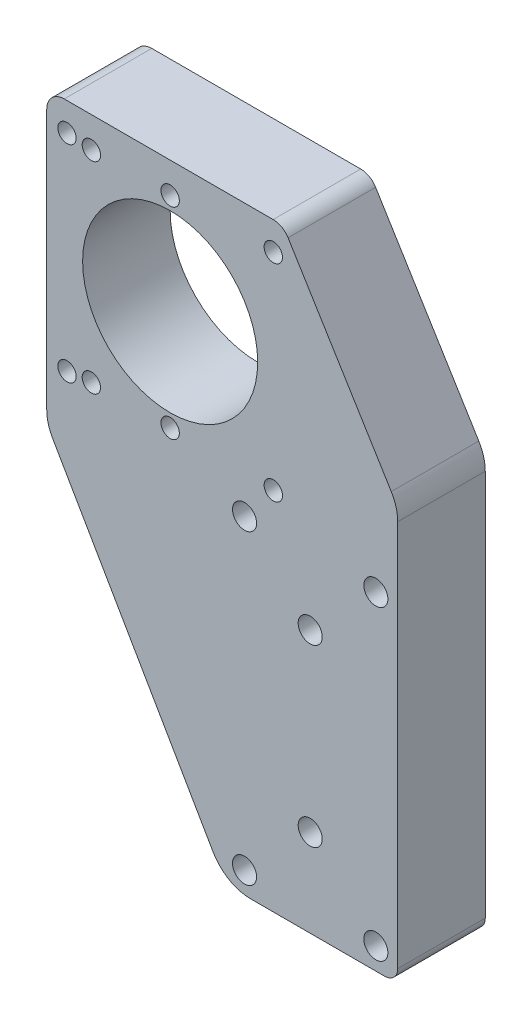
ISO-10303-21;
HEADER;
FILE_DESCRIPTION(('STEP AP214'),'2;1');
FILE_NAME('part.step','',(''),(''),'','','');
FILE_SCHEMA(('AUTOMOTIVE_DESIGN { 1 0 10303 214 1 1 1 1 }'));
ENDSEC;
DATA;
#1=APPLICATION_CONTEXT('core data for automotive mechanical design processes');
#2=APPLICATION_PROTOCOL_DEFINITION('international standard','automotive_design',2000,#1);
#3=PRODUCT_CONTEXT('',#1,'mechanical');
#4=PRODUCT('Part','Part','',(#3));
#5=PRODUCT_RELATED_PRODUCT_CATEGORY('part','',(#4));
#6=PRODUCT_DEFINITION_FORMATION('','',#4);
#7=PRODUCT_DEFINITION_CONTEXT('part definition',#1,'design');
#8=PRODUCT_DEFINITION('design','',#6,#7);
#9=PRODUCT_DEFINITION_SHAPE('','',#8);
#10=(LENGTH_UNIT() NAMED_UNIT(*) SI_UNIT(.MILLI.,.METRE.));
#11=(NAMED_UNIT(*) PLANE_ANGLE_UNIT() SI_UNIT($,.RADIAN.));
#12=(NAMED_UNIT(*) SI_UNIT($,.STERADIAN.) SOLID_ANGLE_UNIT());
#13=UNCERTAINTY_MEASURE_WITH_UNIT(LENGTH_MEASURE(1.E-05),#10,'distance_accuracy_value','');
#14=(GEOMETRIC_REPRESENTATION_CONTEXT(3) GLOBAL_UNCERTAINTY_ASSIGNED_CONTEXT((#13)) GLOBAL_UNIT_ASSIGNED_CONTEXT((#10,
#11,#12)) REPRESENTATION_CONTEXT('',''));
#15=CARTESIAN_POINT('',(0.,0.,0.));
#16=DIRECTION('',(0.,0.,1.));
#17=DIRECTION('',(1.,0.,0.));
#18=AXIS2_PLACEMENT_3D('',#15,#16,#17);
#19=CARTESIAN_POINT('',(-170.200000000702,606.999999999993,20.));
#20=DIRECTION('',(0.,-1.,0.));
#21=DIRECTION('',(0.,0.,-1.));
#22=AXIS2_PLACEMENT_3D('',#19,#20,#21);
#23=PLANE('',#22);
#24=DIRECTION('',(-1.,0.,0.));
#25=VECTOR('',#24,1.);
#26=CARTESIAN_POINT('',(-170.200000000702,606.999999999993,20.));
#27=LINE('',#26,#25);
#28=CARTESIAN_POINT('',(-118.464037729129,606.999999999993,20.));
#29=VERTEX_POINT('',#28);
#30=CARTESIAN_POINT('',(-166.200000000702,606.999999999993,20.));
#31=VERTEX_POINT('',#30);
#32=EDGE_CURVE('E175',#29,#31,#27,.T.);
#33=ORIENTED_EDGE('',*,*,#32,.F.);
#34=DIRECTION('',(0.,0.,-1.));
#35=VECTOR('',#34,1.);
#36=CARTESIAN_POINT('',(-118.464037729129,606.999999999993,20.));
#37=LINE('',#36,#35);
#38=CARTESIAN_POINT('',(-118.464037729129,606.999999999993,0.));
#39=VERTEX_POINT('',#38);
#40=EDGE_CURVE('E205',#29,#39,#37,.T.);
#41=ORIENTED_EDGE('',*,*,#40,.T.);
#42=DIRECTION('',(-1.,0.,0.));
#43=VECTOR('',#42,1.);
#44=CARTESIAN_POINT('',(-170.200000000702,606.999999999993,0.));
#45=LINE('',#44,#43);
#46=CARTESIAN_POINT('',(-166.200000000702,606.999999999993,0.));
#47=VERTEX_POINT('',#46);
#48=EDGE_CURVE('E158',#39,#47,#45,.T.);
#49=ORIENTED_EDGE('',*,*,#48,.T.);
#50=DIRECTION('',(0.,0.,-1.));
#51=VECTOR('',#50,1.);
#52=CARTESIAN_POINT('',(-166.200000000702,606.999999999993,20.));
#53=LINE('',#52,#51);
#54=EDGE_CURVE('E203',#47,#31,#53,.F.);
#55=ORIENTED_EDGE('',*,*,#54,.T.);
#56=EDGE_LOOP('',(#33,#41,#49,#55));
#57=FACE_BOUND('',#56,.T.);
#58=ADVANCED_FACE('F33',(#57),#23,.F.);
#59=CARTESIAN_POINT('',(-170.200000000702,540.82459488831,20.));
#60=DIRECTION('',(1.,0.,0.));
#61=DIRECTION('',(0.,1.,0.));
#62=AXIS2_PLACEMENT_3D('',#59,#60,#61);
#63=PLANE('',#62);
#64=DIRECTION('',(0.,-1.,0.));
#65=VECTOR('',#64,1.);
#66=CARTESIAN_POINT('',(-170.200000000702,540.82459488831,20.));
#67=LINE('',#66,#65);
#68=CARTESIAN_POINT('',(-170.200000000702,602.999999999993,20.));
#69=VERTEX_POINT('',#68);
#70=CARTESIAN_POINT('',(-170.200000000702,543.504086812621,20.));
#71=VERTEX_POINT('',#70);
#72=EDGE_CURVE('E220',#69,#71,#67,.T.);
#73=ORIENTED_EDGE('',*,*,#72,.F.);
#74=DIRECTION('',(0.,0.,-1.));
#75=VECTOR('',#74,1.);
#76=CARTESIAN_POINT('',(-170.200000000702,602.999999999993,20.));
#77=LINE('',#76,#75);
#78=CARTESIAN_POINT('',(-170.200000000702,602.999999999993,0.));
#79=VERTEX_POINT('',#78);
#80=EDGE_CURVE('E11',#69,#79,#77,.T.);
#81=ORIENTED_EDGE('',*,*,#80,.T.);
#82=DIRECTION('',(0.,-1.,0.));
#83=VECTOR('',#82,1.);
#84=CARTESIAN_POINT('',(-170.200000000702,540.82459488831,0.));
#85=LINE('',#84,#83);
#86=CARTESIAN_POINT('',(-170.200000000702,543.504086812621,0.));
#87=VERTEX_POINT('',#86);
#88=EDGE_CURVE('E161',#79,#87,#85,.T.);
#89=ORIENTED_EDGE('',*,*,#88,.T.);
#90=DIRECTION('',(0.,0.,-1.));
#91=VECTOR('',#90,1.);
#92=CARTESIAN_POINT('',(-170.200000000702,543.504086812621,20.));
#93=LINE('',#92,#91);
#94=EDGE_CURVE('E195',#87,#71,#93,.F.);
#95=ORIENTED_EDGE('',*,*,#94,.T.);
#96=EDGE_LOOP('',(#73,#81,#89,#95));
#97=FACE_BOUND('',#96,.T.);
#98=ADVANCED_FACE('F244',(#97),#63,.F.);
#99=CARTESIAN_POINT('',(-170.200000000702,540.82459488831,20.));
#100=DIRECTION('',(0.866025403784438,0.5,0.));
#101=DIRECTION('',(-0.5,0.866025403784439,0.));
#102=AXIS2_PLACEMENT_3D('',#99,#100,#101);
#103=PLANE('',#102);
#104=DIRECTION('',(0.5,-0.866025403784438,0.));
#105=VECTOR('',#104,1.);
#106=CARTESIAN_POINT('',(-170.200000000702,540.82459488831,0.));
#107=LINE('',#106,#105);
#108=CARTESIAN_POINT('',(-168.860254038547,538.504086812621,0.));
#109=VERTEX_POINT('',#108);
#110=CARTESIAN_POINT('',(-132.196152422639,475.000000000001,0.));
#111=VERTEX_POINT('',#110);
#112=EDGE_CURVE('E164',#109,#111,#107,.T.);
#113=ORIENTED_EDGE('',*,*,#112,.T.);
#114=DIRECTION('',(0.,0.,-1.));
#115=VECTOR('',#114,1.);
#116=CARTESIAN_POINT('',(-132.196152422639,475.000000000001,20.));
#117=LINE('',#116,#115);
#118=CARTESIAN_POINT('',(-132.196152422639,475.000000000001,20.));
#119=VERTEX_POINT('',#118);
#120=EDGE_CURVE('E188',#111,#119,#117,.F.);
#121=ORIENTED_EDGE('',*,*,#120,.T.);
#122=DIRECTION('',(0.5,-0.866025403784438,0.));
#123=VECTOR('',#122,1.);
#124=CARTESIAN_POINT('',(-170.200000000702,540.82459488831,20.));
#125=LINE('',#124,#123);
#126=CARTESIAN_POINT('',(-168.860254038547,538.504086812621,20.));
#127=VERTEX_POINT('',#126);
#128=EDGE_CURVE('E136',#127,#119,#125,.T.);
#129=ORIENTED_EDGE('',*,*,#128,.F.);
#130=DIRECTION('',(0.,0.,-1.));
#131=VECTOR('',#130,1.);
#132=CARTESIAN_POINT('',(-168.860254038547,538.504086812621,20.));
#133=LINE('',#132,#131);
#134=EDGE_CURVE('E185',#127,#109,#133,.T.);
#135=ORIENTED_EDGE('',*,*,#134,.T.);
#136=EDGE_LOOP('',(#113,#121,#129,#135));
#137=FACE_BOUND('',#136,.T.);
#138=ADVANCED_FACE('F249',(#137),#103,.F.);
#139=CARTESIAN_POINT('',(-129.30940107669,470.000000000001,20.));
#140=DIRECTION('',(0.,1.,0.));
#141=DIRECTION('',(-1.,0.,0.));
#142=AXIS2_PLACEMENT_3D('',#139,#140,#141);
#143=PLANE('',#142);
#144=DIRECTION('',(1.,0.,0.));
#145=VECTOR('',#144,1.);
#146=CARTESIAN_POINT('',(-129.30940107669,470.000000000001,20.));
#147=LINE('',#146,#145);
#148=CARTESIAN_POINT('',(-123.535898384794,470.000000000001,20.));
#149=VERTEX_POINT('',#148);
#150=CARTESIAN_POINT('',(-92.9999999999341,470.,20.));
#151=VERTEX_POINT('',#150);
#152=EDGE_CURVE('E123',#149,#151,#147,.T.);
#153=ORIENTED_EDGE('',*,*,#152,.F.);
#154=DIRECTION('',(0.,0.,-1.));
#155=VECTOR('',#154,1.);
#156=CARTESIAN_POINT('',(-123.535898384794,470.000000000001,20.));
#157=LINE('',#156,#155);
#158=CARTESIAN_POINT('',(-123.535898384794,470.000000000001,0.));
#159=VERTEX_POINT('',#158);
#160=EDGE_CURVE('E145',#149,#159,#157,.T.);
#161=ORIENTED_EDGE('',*,*,#160,.T.);
#162=DIRECTION('',(1.,0.,0.));
#163=VECTOR('',#162,1.);
#164=CARTESIAN_POINT('',(-129.30940107669,470.000000000001,0.));
#165=LINE('',#164,#163);
#166=CARTESIAN_POINT('',(-92.9999999999341,470.,0.));
#167=VERTEX_POINT('',#166);
#168=EDGE_CURVE('E142',#159,#167,#165,.T.);
#169=ORIENTED_EDGE('',*,*,#168,.T.);
#170=DIRECTION('',(0.,0.,-1.));
#171=VECTOR('',#170,1.);
#172=CARTESIAN_POINT('',(-92.9999999999341,470.,20.));
#173=LINE('',#172,#171);
#174=EDGE_CURVE('E139',#151,#167,#173,.T.);
#175=ORIENTED_EDGE('',*,*,#174,.F.);
#176=EDGE_LOOP('',(#153,#161,#169,#175));
#177=FACE_BOUND('',#176,.T.);
#178=ADVANCED_FACE('F140',(#177),#143,.F.);
#179=CARTESIAN_POINT('',(-92.9999999999341,473.,20.));
#180=DIRECTION('',(0.,0.,-1.));
#181=DIRECTION('',(-1.,0.,0.));
#182=AXIS2_PLACEMENT_3D('',#179,#180,#181);
#183=CYLINDRICAL_SURFACE('',#182,3.);
#184=CARTESIAN_POINT('',(-92.9999999999341,473.,0.));
#185=DIRECTION('',(0.,0.,1.));
#186=DIRECTION('',(-1.,0.,0.));
#187=AXIS2_PLACEMENT_3D('',#184,#185,#186);
#188=CIRCLE('',#187,3.);
#189=CARTESIAN_POINT('',(-89.9999999999341,473.,0.));
#190=VERTEX_POINT('',#189);
#191=EDGE_CURVE('E168',#167,#190,#188,.T.);
#192=ORIENTED_EDGE('',*,*,#191,.T.);
#193=DIRECTION('',(0.,0.,-1.));
#194=VECTOR('',#193,1.);
#195=CARTESIAN_POINT('',(-89.9999999999341,473.,20.));
#196=LINE('',#195,#194);
#197=CARTESIAN_POINT('',(-89.9999999999341,473.,20.));
#198=VERTEX_POINT('',#197);
#199=EDGE_CURVE('E146',#198,#190,#196,.T.);
#200=ORIENTED_EDGE('',*,*,#199,.F.);
#201=CARTESIAN_POINT('',(-92.9999999999341,473.,20.));
#202=DIRECTION('',(0.,0.,1.));
#203=DIRECTION('',(-1.,0.,0.));
#204=AXIS2_PLACEMENT_3D('',#201,#202,#203);
#205=CIRCLE('',#204,3.);
#206=EDGE_CURVE('E128',#151,#198,#205,.T.);
#207=ORIENTED_EDGE('',*,*,#206,.F.);
#208=ORIENTED_EDGE('',*,*,#174,.T.);
#209=EDGE_LOOP('',(#192,#200,#207,#208));
#210=FACE_BOUND('',#209,.T.);
#211=ADVANCED_FACE('F148',(#210),#183,.T.);
#212=CARTESIAN_POINT('',(-89.9999999999341,473.,20.));
#213=DIRECTION('',(-1.,0.,0.));
#214=DIRECTION('',(0.,-1.,0.));
#215=AXIS2_PLACEMENT_3D('',#212,#213,#214);
#216=PLANE('',#215);
#217=DIRECTION('',(0.,1.,0.));
#218=VECTOR('',#217,1.);
#219=CARTESIAN_POINT('',(-89.9999999999341,473.,0.));
#220=LINE('',#219,#218);
#221=CARTESIAN_POINT('',(-89.9999999999332,561.432106106264,0.));
#222=VERTEX_POINT('',#221);
#223=EDGE_CURVE('E170',#190,#222,#220,.T.);
#224=ORIENTED_EDGE('',*,*,#223,.T.);
#225=DIRECTION('',(0.,0.,-1.));
#226=VECTOR('',#225,1.);
#227=CARTESIAN_POINT('',(-89.9999999999332,561.432106106264,20.));
#228=LINE('',#227,#226);
#229=CARTESIAN_POINT('',(-89.9999999999332,561.432106106264,20.));
#230=VERTEX_POINT('',#229);
#231=EDGE_CURVE('E201',#222,#230,#228,.F.);
#232=ORIENTED_EDGE('',*,*,#231,.T.);
#233=DIRECTION('',(0.,1.,0.));
#234=VECTOR('',#233,1.);
#235=CARTESIAN_POINT('',(-89.9999999999341,473.,20.));
#236=LINE('',#235,#234);
#237=EDGE_CURVE('E151',#198,#230,#236,.T.);
#238=ORIENTED_EDGE('',*,*,#237,.F.);
#239=ORIENTED_EDGE('',*,*,#199,.T.);
#240=EDGE_LOOP('',(#224,#232,#238,#239));
#241=FACE_BOUND('',#240,.T.);
#242=ADVANCED_FACE('F234',(#241),#216,.F.);
#243=CARTESIAN_POINT('',(-116.22532923768,606.999999999993,20.));
#244=DIRECTION('',(-0.852361746316741,-0.522952630183533,0.));
#245=DIRECTION('',(0.522952630183533,-0.852361746316741,0.));
#246=AXIS2_PLACEMENT_3D('',#243,#244,#245);
#247=PLANE('',#246);
#248=DIRECTION('',(-0.522952630183533,0.852361746316741,0.));
#249=VECTOR('',#248,1.);
#250=CARTESIAN_POINT('',(-116.22532923768,606.999999999993,0.));
#251=LINE('',#250,#249);
#252=CARTESIAN_POINT('',(-91.4763825367658,566.661632408099,0.));
#253=VERTEX_POINT('',#252);
#254=CARTESIAN_POINT('',(-115.054590743862,605.091810520727,0.));
#255=VERTEX_POINT('',#254);
#256=EDGE_CURVE('E173',#253,#255,#251,.T.);
#257=ORIENTED_EDGE('',*,*,#256,.T.);
#258=DIRECTION('',(0.,0.,-1.));
#259=VECTOR('',#258,1.);
#260=CARTESIAN_POINT('',(-115.054590743862,605.091810520727,20.));
#261=LINE('',#260,#259);
#262=CARTESIAN_POINT('',(-115.054590743862,605.091810520727,20.));
#263=VERTEX_POINT('',#262);
#264=EDGE_CURVE('E56',#255,#263,#261,.F.);
#265=ORIENTED_EDGE('',*,*,#264,.T.);
#266=DIRECTION('',(-0.522952630183533,0.852361746316741,0.));
#267=VECTOR('',#266,1.);
#268=CARTESIAN_POINT('',(-116.22532923768,606.999999999993,20.));
#269=LINE('',#268,#267);
#270=CARTESIAN_POINT('',(-91.4763825367658,566.661632408099,20.));
#271=VERTEX_POINT('',#270);
#272=EDGE_CURVE('E153',#271,#263,#269,.T.);
#273=ORIENTED_EDGE('',*,*,#272,.F.);
#274=DIRECTION('',(0.,0.,-1.));
#275=VECTOR('',#274,1.);
#276=CARTESIAN_POINT('',(-91.4763825367658,566.661632408099,20.));
#277=LINE('',#276,#275);
#278=EDGE_CURVE('E198',#271,#253,#277,.T.);
#279=ORIENTED_EDGE('',*,*,#278,.T.);
#280=EDGE_LOOP('',(#257,#265,#273,#279));
#281=FACE_BOUND('',#280,.T.);
#282=ADVANCED_FACE('F226',(#281),#247,.F.);
#283=CARTESIAN_POINT('',(-92.9999999999341,473.,20.));
#284=DIRECTION('',(0.,0.,-1.));
#285=DIRECTION('',(-1.,0.,0.));
#286=AXIS2_PLACEMENT_3D('',#283,#284,#285);
#287=PLANE('',#286);
#288=CARTESIAN_POINT('',(-165.570000000788,553.43000000002,20.));
#289=DIRECTION('',(0.,0.,1.));
#290=DIRECTION('',(1.,0.,0.));
#291=AXIS2_PLACEMENT_3D('',#288,#289,#290);
#292=CIRCLE('',#291,2.09999999999999);
#293=CARTESIAN_POINT('',(-163.470000000788,553.43000000002,20.));
#294=VERTEX_POINT('',#293);
#295=EDGE_CURVE('E632',#294,#294,#292,.T.);
#296=ORIENTED_EDGE('',*,*,#295,.F.);
#297=EDGE_LOOP('',(#296));
#298=FACE_BOUND('',#297,.T.);
#299=CARTESIAN_POINT('',(-165.570000000788,600.57000000002,20.));
#300=DIRECTION('',(0.,0.,1.));
#301=DIRECTION('',(1.,0.,0.));
#302=AXIS2_PLACEMENT_3D('',#299,#300,#301);
#303=CIRCLE('',#302,2.09999999999999);
#304=CARTESIAN_POINT('',(-163.470000000788,600.57000000002,20.));
#305=VERTEX_POINT('',#304);
#306=EDGE_CURVE('E628',#305,#305,#303,.T.);
#307=ORIENTED_EDGE('',*,*,#306,.F.);
#308=EDGE_LOOP('',(#307));
#309=FACE_BOUND('',#308,.T.);
#310=CARTESIAN_POINT('',(-118.430000000788,553.43000000002,20.));
#311=DIRECTION('',(0.,0.,1.));
#312=DIRECTION('',(1.,0.,0.));
#313=AXIS2_PLACEMENT_3D('',#310,#311,#312);
#314=CIRCLE('',#313,2.1);
#315=CARTESIAN_POINT('',(-116.330000000788,553.43000000002,20.));
#316=VERTEX_POINT('',#315);
#317=EDGE_CURVE('E624',#316,#316,#314,.T.);
#318=ORIENTED_EDGE('',*,*,#317,.F.);
#319=EDGE_LOOP('',(#318));
#320=FACE_BOUND('',#319,.T.);
#321=CARTESIAN_POINT('',(-118.430000000788,600.57000000002,20.));
#322=DIRECTION('',(0.,0.,1.));
#323=DIRECTION('',(1.,0.,0.));
#324=AXIS2_PLACEMENT_3D('',#321,#322,#323);
#325=CIRCLE('',#324,2.1);
#326=CARTESIAN_POINT('',(-116.330000000788,600.57000000002,20.));
#327=VERTEX_POINT('',#326);
#328=EDGE_CURVE('E620',#327,#327,#325,.T.);
#329=ORIENTED_EDGE('',*,*,#328,.F.);
#330=EDGE_LOOP('',(#329));
#331=FACE_BOUND('',#330,.T.);
#332=CARTESIAN_POINT('',(-94.999999999934,544.999999999999,20.));
#333=DIRECTION('',(0.,0.,1.));
#334=DIRECTION('',(1.,0.,0.));
#335=AXIS2_PLACEMENT_3D('',#332,#333,#334);
#336=CIRCLE('',#335,2.75);
#337=CARTESIAN_POINT('',(-92.249999999934,544.999999999999,20.));
#338=VERTEX_POINT('',#337);
#339=EDGE_CURVE('E616',#338,#338,#336,.T.);
#340=ORIENTED_EDGE('',*,*,#339,.F.);
#341=EDGE_LOOP('',(#340));
#342=FACE_BOUND('',#341,.T.);
#343=CARTESIAN_POINT('',(-124.999999999934,544.999999999999,20.));
#344=DIRECTION('',(0.,0.,1.));
#345=DIRECTION('',(1.,0.,0.));
#346=AXIS2_PLACEMENT_3D('',#343,#344,#345);
#347=CIRCLE('',#346,2.75);
#348=CARTESIAN_POINT('',(-122.249999999934,544.999999999999,20.));
#349=VERTEX_POINT('',#348);
#350=EDGE_CURVE('E612',#349,#349,#347,.T.);
#351=ORIENTED_EDGE('',*,*,#350,.F.);
#352=EDGE_LOOP('',(#351));
#353=FACE_BOUND('',#352,.T.);
#354=CARTESIAN_POINT('',(-124.999999999934,475.,20.));
#355=DIRECTION('',(0.,0.,1.));
#356=DIRECTION('',(1.,0.,0.));
#357=AXIS2_PLACEMENT_3D('',#354,#355,#356);
#358=CIRCLE('',#357,2.75);
#359=CARTESIAN_POINT('',(-122.249999999934,475.,20.));
#360=VERTEX_POINT('',#359);
#361=EDGE_CURVE('E608',#360,#360,#358,.T.);
#362=ORIENTED_EDGE('',*,*,#361,.F.);
#363=EDGE_LOOP('',(#362));
#364=FACE_BOUND('',#363,.T.);
#365=CARTESIAN_POINT('',(-94.999999999934,475.,20.));
#366=DIRECTION('',(0.,0.,1.));
#367=DIRECTION('',(1.,0.,0.));
#368=AXIS2_PLACEMENT_3D('',#365,#366,#367);
#369=CIRCLE('',#368,2.75);
#370=CARTESIAN_POINT('',(-92.249999999934,475.,20.));
#371=VERTEX_POINT('',#370);
#372=EDGE_CURVE('E604',#371,#371,#369,.T.);
#373=ORIENTED_EDGE('',*,*,#372,.F.);
#374=EDGE_LOOP('',(#373));
#375=FACE_BOUND('',#374,.T.);
#376=CARTESIAN_POINT('',(-109.999999999934,490.,20.));
#377=DIRECTION('',(0.,0.,1.));
#378=DIRECTION('',(1.,0.,0.));
#379=AXIS2_PLACEMENT_3D('',#376,#377,#378);
#380=CIRCLE('',#379,2.75);
#381=CARTESIAN_POINT('',(-107.249999999934,490.,20.));
#382=VERTEX_POINT('',#381);
#383=EDGE_CURVE('E600',#382,#382,#380,.T.);
#384=ORIENTED_EDGE('',*,*,#383,.F.);
#385=EDGE_LOOP('',(#384));
#386=FACE_BOUND('',#385,.T.);
#387=CARTESIAN_POINT('',(-109.999999999934,530.,20.));
#388=DIRECTION('',(0.,0.,1.));
#389=DIRECTION('',(1.,0.,0.));
#390=AXIS2_PLACEMENT_3D('',#387,#388,#389);
#391=CIRCLE('',#390,2.75);
#392=CARTESIAN_POINT('',(-107.249999999934,530.,20.));
#393=VERTEX_POINT('',#392);
#394=EDGE_CURVE('E596',#393,#393,#391,.T.);
#395=ORIENTED_EDGE('',*,*,#394,.F.);
#396=EDGE_LOOP('',(#395));
#397=FACE_BOUND('',#396,.T.);
#398=CARTESIAN_POINT('',(-160.000000000783,600.000000000024,20.));
#399=DIRECTION('',(0.,0.,-1.));
#400=DIRECTION('',(-1.,0.,0.));
#401=AXIS2_PLACEMENT_3D('',#398,#399,#400);
#402=CIRCLE('',#401,2.09999999999999);
#403=CARTESIAN_POINT('',(-162.100000000783,600.000000000024,20.));
#404=VERTEX_POINT('',#403);
#405=EDGE_CURVE('E591',#404,#404,#402,.T.);
#406=ORIENTED_EDGE('',*,*,#405,.T.);
#407=EDGE_LOOP('',(#406));
#408=FACE_BOUND('',#407,.T.);
#409=CARTESIAN_POINT('',(-142.000000000783,600.000000000024,20.));
#410=DIRECTION('',(0.,0.,-1.));
#411=DIRECTION('',(-1.,0.,0.));
#412=AXIS2_PLACEMENT_3D('',#409,#410,#411);
#413=CIRCLE('',#412,2.09999999999999);
#414=CARTESIAN_POINT('',(-144.100000000783,600.000000000024,20.));
#415=VERTEX_POINT('',#414);
#416=EDGE_CURVE('E587',#415,#415,#413,.T.);
#417=ORIENTED_EDGE('',*,*,#416,.T.);
#418=EDGE_LOOP('',(#417));
#419=FACE_BOUND('',#418,.T.);
#420=CARTESIAN_POINT('',(-142.000000000783,554.000000000024,20.));
#421=DIRECTION('',(0.,0.,-1.));
#422=DIRECTION('',(-1.,0.,0.));
#423=AXIS2_PLACEMENT_3D('',#420,#421,#422);
#424=CIRCLE('',#423,2.09999999999999);
#425=CARTESIAN_POINT('',(-144.100000000783,554.000000000024,20.));
#426=VERTEX_POINT('',#425);
#427=EDGE_CURVE('E583',#426,#426,#424,.T.);
#428=ORIENTED_EDGE('',*,*,#427,.T.);
#429=EDGE_LOOP('',(#428));
#430=FACE_BOUND('',#429,.T.);
#431=CARTESIAN_POINT('',(-160.000000000783,554.000000000024,20.));
#432=DIRECTION('',(0.,0.,-1.));
#433=DIRECTION('',(-1.,0.,0.));
#434=AXIS2_PLACEMENT_3D('',#431,#432,#433);
#435=CIRCLE('',#434,2.09999999999999);
#436=CARTESIAN_POINT('',(-162.100000000783,554.000000000024,20.));
#437=VERTEX_POINT('',#436);
#438=EDGE_CURVE('E400',#437,#437,#435,.T.);
#439=ORIENTED_EDGE('',*,*,#438,.T.);
#440=EDGE_LOOP('',(#439));
#441=FACE_BOUND('',#440,.T.);
#442=CARTESIAN_POINT('',(-142.000000000788,577.00000000002,20.));
#443=DIRECTION('',(0.,0.,1.));
#444=DIRECTION('',(1.,0.,0.));
#445=AXIS2_PLACEMENT_3D('',#442,#443,#444);
#446=CIRCLE('',#445,20.);
#447=CARTESIAN_POINT('',(-122.000000000788,577.00000000002,20.));
#448=VERTEX_POINT('',#447);
#449=EDGE_CURVE('E397',#448,#448,#446,.T.);
#450=ORIENTED_EDGE('',*,*,#449,.F.);
#451=EDGE_LOOP('',(#450));
#452=FACE_BOUND('',#451,.T.);
#453=ORIENTED_EDGE('',*,*,#272,.T.);
#454=CARTESIAN_POINT('',(-118.464037729129,602.999999999993,20.));
#455=DIRECTION('',(0.,0.,-1.));
#456=DIRECTION('',(-1.,0.,0.));
#457=AXIS2_PLACEMENT_3D('',#454,#455,#456);
#458=CIRCLE('',#457,4.);
#459=EDGE_CURVE('E41',#263,#29,#458,.F.);
#460=ORIENTED_EDGE('',*,*,#459,.T.);
#461=ORIENTED_EDGE('',*,*,#32,.T.);
#462=CARTESIAN_POINT('',(-166.200000000702,602.999999999993,20.));
#463=DIRECTION('',(0.,0.,-1.));
#464=DIRECTION('',(-1.,0.,0.));
#465=AXIS2_PLACEMENT_3D('',#462,#463,#464);
#466=CIRCLE('',#465,4.);
#467=EDGE_CURVE('E48',#31,#69,#466,.F.);
#468=ORIENTED_EDGE('',*,*,#467,.T.);
#469=ORIENTED_EDGE('',*,*,#72,.T.);
#470=CARTESIAN_POINT('',(-160.200000000702,543.504086812621,20.));
#471=DIRECTION('',(0.,0.,-1.));
#472=DIRECTION('',(-1.,0.,0.));
#473=AXIS2_PLACEMENT_3D('',#470,#471,#472);
#474=CIRCLE('',#473,10.);
#475=EDGE_CURVE('E192',#71,#127,#474,.F.);
#476=ORIENTED_EDGE('',*,*,#475,.T.);
#477=ORIENTED_EDGE('',*,*,#128,.T.);
#478=CARTESIAN_POINT('',(-123.535898384794,480.000000000001,20.));
#479=DIRECTION('',(0.,0.,-1.));
#480=DIRECTION('',(-1.,0.,0.));
#481=AXIS2_PLACEMENT_3D('',#478,#479,#480);
#482=CIRCLE('',#481,10.);
#483=EDGE_CURVE('E132',#119,#149,#482,.F.);
#484=ORIENTED_EDGE('',*,*,#483,.T.);
#485=ORIENTED_EDGE('',*,*,#152,.T.);
#486=ORIENTED_EDGE('',*,*,#206,.T.);
#487=ORIENTED_EDGE('',*,*,#237,.T.);
#488=CARTESIAN_POINT('',(-99.9999999999332,561.432106106264,20.));
#489=DIRECTION('',(0.,0.,-1.));
#490=DIRECTION('',(-1.,0.,0.));
#491=AXIS2_PLACEMENT_3D('',#488,#489,#490);
#492=CIRCLE('',#491,10.);
#493=EDGE_CURVE('E190',#230,#271,#492,.F.);
#494=ORIENTED_EDGE('',*,*,#493,.T.);
#495=EDGE_LOOP('',(#453,#460,#461,#468,#469,#476,#477,#484,#485,#486,#487,#494));
#496=FACE_BOUND('',#495,.T.);
#497=ADVANCED_FACE('F125',(#298,#309,#320,#331,#342,#353,#364,#375,#386,#397,#408,#419,#430,
#441,#452,#496),#287,.F.);
#498=CARTESIAN_POINT('',(-92.9999999999341,473.,0.));
#499=DIRECTION('',(0.,0.,-1.));
#500=DIRECTION('',(-1.,0.,0.));
#501=AXIS2_PLACEMENT_3D('',#498,#499,#500);
#502=PLANE('',#501);
#503=CARTESIAN_POINT('',(-165.570000000788,553.43000000002,0.));
#504=DIRECTION('',(0.,0.,1.));
#505=DIRECTION('',(1.,0.,0.));
#506=AXIS2_PLACEMENT_3D('',#503,#504,#505);
#507=CIRCLE('',#506,2.09999999999999);
#508=CARTESIAN_POINT('',(-163.470000000788,553.43000000002,0.));
#509=VERTEX_POINT('',#508);
#510=EDGE_CURVE('E342',#509,#509,#507,.T.);
#511=ORIENTED_EDGE('',*,*,#510,.T.);
#512=EDGE_LOOP('',(#511));
#513=FACE_BOUND('',#512,.T.);
#514=CARTESIAN_POINT('',(-165.570000000788,600.57000000002,0.));
#515=DIRECTION('',(0.,0.,1.));
#516=DIRECTION('',(1.,0.,0.));
#517=AXIS2_PLACEMENT_3D('',#514,#515,#516);
#518=CIRCLE('',#517,2.09999999999999);
#519=CARTESIAN_POINT('',(-163.470000000788,600.57000000002,0.));
#520=VERTEX_POINT('',#519);
#521=EDGE_CURVE('E346',#520,#520,#518,.T.);
#522=ORIENTED_EDGE('',*,*,#521,.T.);
#523=EDGE_LOOP('',(#522));
#524=FACE_BOUND('',#523,.T.);
#525=CARTESIAN_POINT('',(-118.430000000788,553.43000000002,0.));
#526=DIRECTION('',(0.,0.,1.));
#527=DIRECTION('',(1.,0.,0.));
#528=AXIS2_PLACEMENT_3D('',#525,#526,#527);
#529=CIRCLE('',#528,2.09999999999999);
#530=CARTESIAN_POINT('',(-116.330000000788,553.43000000002,0.));
#531=VERTEX_POINT('',#530);
#532=EDGE_CURVE('E350',#531,#531,#529,.T.);
#533=ORIENTED_EDGE('',*,*,#532,.T.);
#534=EDGE_LOOP('',(#533));
#535=FACE_BOUND('',#534,.T.);
#536=CARTESIAN_POINT('',(-118.430000000788,600.57000000002,0.));
#537=DIRECTION('',(0.,0.,1.));
#538=DIRECTION('',(1.,0.,0.));
#539=AXIS2_PLACEMENT_3D('',#536,#537,#538);
#540=CIRCLE('',#539,2.09999999999999);
#541=CARTESIAN_POINT('',(-116.330000000788,600.57000000002,0.));
#542=VERTEX_POINT('',#541);
#543=EDGE_CURVE('E354',#542,#542,#540,.T.);
#544=ORIENTED_EDGE('',*,*,#543,.T.);
#545=EDGE_LOOP('',(#544));
#546=FACE_BOUND('',#545,.T.);
#547=CARTESIAN_POINT('',(-94.999999999934,544.999999999999,0.));
#548=DIRECTION('',(0.,0.,1.));
#549=DIRECTION('',(1.,0.,0.));
#550=AXIS2_PLACEMENT_3D('',#547,#548,#549);
#551=CIRCLE('',#550,2.74999999999999);
#552=CARTESIAN_POINT('',(-92.249999999934,544.999999999999,0.));
#553=VERTEX_POINT('',#552);
#554=EDGE_CURVE('E358',#553,#553,#551,.T.);
#555=ORIENTED_EDGE('',*,*,#554,.T.);
#556=EDGE_LOOP('',(#555));
#557=FACE_BOUND('',#556,.T.);
#558=CARTESIAN_POINT('',(-124.999999999934,544.999999999999,0.));
#559=DIRECTION('',(0.,0.,1.));
#560=DIRECTION('',(1.,0.,0.));
#561=AXIS2_PLACEMENT_3D('',#558,#559,#560);
#562=CIRCLE('',#561,2.74999999999999);
#563=CARTESIAN_POINT('',(-122.249999999934,544.999999999999,0.));
#564=VERTEX_POINT('',#563);
#565=EDGE_CURVE('E362',#564,#564,#562,.T.);
#566=ORIENTED_EDGE('',*,*,#565,.T.);
#567=EDGE_LOOP('',(#566));
#568=FACE_BOUND('',#567,.T.);
#569=CARTESIAN_POINT('',(-124.999999999934,475.,0.));
#570=DIRECTION('',(0.,0.,1.));
#571=DIRECTION('',(1.,0.,0.));
#572=AXIS2_PLACEMENT_3D('',#569,#570,#571);
#573=CIRCLE('',#572,2.74999999999999);
#574=CARTESIAN_POINT('',(-122.249999999934,475.,0.));
#575=VERTEX_POINT('',#574);
#576=EDGE_CURVE('E366',#575,#575,#573,.T.);
#577=ORIENTED_EDGE('',*,*,#576,.T.);
#578=EDGE_LOOP('',(#577));
#579=FACE_BOUND('',#578,.T.);
#580=CARTESIAN_POINT('',(-94.999999999934,475.,0.));
#581=DIRECTION('',(0.,0.,1.));
#582=DIRECTION('',(1.,0.,0.));
#583=AXIS2_PLACEMENT_3D('',#580,#581,#582);
#584=CIRCLE('',#583,2.74999999999999);
#585=CARTESIAN_POINT('',(-92.249999999934,475.,0.));
#586=VERTEX_POINT('',#585);
#587=EDGE_CURVE('E370',#586,#586,#584,.T.);
#588=ORIENTED_EDGE('',*,*,#587,.T.);
#589=EDGE_LOOP('',(#588));
#590=FACE_BOUND('',#589,.T.);
#591=CARTESIAN_POINT('',(-109.999999999934,490.,0.));
#592=DIRECTION('',(0.,0.,1.));
#593=DIRECTION('',(1.,0.,0.));
#594=AXIS2_PLACEMENT_3D('',#591,#592,#593);
#595=CIRCLE('',#594,2.74999999999999);
#596=CARTESIAN_POINT('',(-107.249999999934,490.,0.));
#597=VERTEX_POINT('',#596);
#598=EDGE_CURVE('E374',#597,#597,#595,.T.);
#599=ORIENTED_EDGE('',*,*,#598,.T.);
#600=EDGE_LOOP('',(#599));
#601=FACE_BOUND('',#600,.T.);
#602=CARTESIAN_POINT('',(-109.999999999934,530.,0.));
#603=DIRECTION('',(0.,0.,1.));
#604=DIRECTION('',(1.,0.,0.));
#605=AXIS2_PLACEMENT_3D('',#602,#603,#604);
#606=CIRCLE('',#605,2.74999999999999);
#607=CARTESIAN_POINT('',(-107.249999999934,530.,0.));
#608=VERTEX_POINT('',#607);
#609=EDGE_CURVE('E378',#608,#608,#606,.T.);
#610=ORIENTED_EDGE('',*,*,#609,.T.);
#611=EDGE_LOOP('',(#610));
#612=FACE_BOUND('',#611,.T.);
#613=CARTESIAN_POINT('',(-160.000000000783,600.000000000024,0.));
#614=DIRECTION('',(0.,0.,-1.));
#615=DIRECTION('',(-1.,0.,0.));
#616=AXIS2_PLACEMENT_3D('',#613,#614,#615);
#617=CIRCLE('',#616,2.09999999999999);
#618=CARTESIAN_POINT('',(-162.100000000783,600.000000000024,0.));
#619=VERTEX_POINT('',#618);
#620=EDGE_CURVE('E382',#619,#619,#617,.T.);
#621=ORIENTED_EDGE('',*,*,#620,.F.);
#622=EDGE_LOOP('',(#621));
#623=FACE_BOUND('',#622,.T.);
#624=CARTESIAN_POINT('',(-142.000000000783,600.000000000024,0.));
#625=DIRECTION('',(0.,0.,-1.));
#626=DIRECTION('',(-1.,0.,0.));
#627=AXIS2_PLACEMENT_3D('',#624,#625,#626);
#628=CIRCLE('',#627,2.09999999999999);
#629=CARTESIAN_POINT('',(-144.100000000783,600.000000000024,0.));
#630=VERTEX_POINT('',#629);
#631=EDGE_CURVE('E386',#630,#630,#628,.T.);
#632=ORIENTED_EDGE('',*,*,#631,.F.);
#633=EDGE_LOOP('',(#632));
#634=FACE_BOUND('',#633,.T.);
#635=CARTESIAN_POINT('',(-142.000000000783,554.000000000024,0.));
#636=DIRECTION('',(0.,0.,-1.));
#637=DIRECTION('',(-1.,0.,0.));
#638=AXIS2_PLACEMENT_3D('',#635,#636,#637);
#639=CIRCLE('',#638,2.09999999999999);
#640=CARTESIAN_POINT('',(-144.100000000783,554.000000000024,0.));
#641=VERTEX_POINT('',#640);
#642=EDGE_CURVE('E390',#641,#641,#639,.T.);
#643=ORIENTED_EDGE('',*,*,#642,.F.);
#644=EDGE_LOOP('',(#643));
#645=FACE_BOUND('',#644,.T.);
#646=CARTESIAN_POINT('',(-160.000000000783,554.000000000024,0.));
#647=DIRECTION('',(0.,0.,-1.));
#648=DIRECTION('',(-1.,0.,0.));
#649=AXIS2_PLACEMENT_3D('',#646,#647,#648);
#650=CIRCLE('',#649,2.09999999999999);
#651=CARTESIAN_POINT('',(-162.100000000783,554.000000000024,0.));
#652=VERTEX_POINT('',#651);
#653=EDGE_CURVE('E394',#652,#652,#650,.T.);
#654=ORIENTED_EDGE('',*,*,#653,.F.);
#655=EDGE_LOOP('',(#654));
#656=FACE_BOUND('',#655,.T.);
#657=CARTESIAN_POINT('',(-142.000000000788,577.00000000002,0.));
#658=DIRECTION('',(0.,0.,1.));
#659=DIRECTION('',(1.,0.,0.));
#660=AXIS2_PLACEMENT_3D('',#657,#658,#659);
#661=CIRCLE('',#660,20.);
#662=CARTESIAN_POINT('',(-122.000000000788,577.00000000002,0.));
#663=VERTEX_POINT('',#662);
#664=EDGE_CURVE('E162',#663,#663,#661,.T.);
#665=ORIENTED_EDGE('',*,*,#664,.T.);
#666=EDGE_LOOP('',(#665));
#667=FACE_BOUND('',#666,.T.);
#668=ORIENTED_EDGE('',*,*,#48,.F.);
#669=CARTESIAN_POINT('',(-118.464037729129,602.999999999993,0.));
#670=DIRECTION('',(0.,0.,-1.));
#671=DIRECTION('',(-1.,0.,0.));
#672=AXIS2_PLACEMENT_3D('',#669,#670,#671);
#673=CIRCLE('',#672,4.);
#674=EDGE_CURVE('E210',#39,#255,#673,.T.);
#675=ORIENTED_EDGE('',*,*,#674,.T.);
#676=ORIENTED_EDGE('',*,*,#256,.F.);
#677=CARTESIAN_POINT('',(-99.9999999999332,561.432106106264,0.));
#678=DIRECTION('',(0.,0.,-1.));
#679=DIRECTION('',(-1.,0.,0.));
#680=AXIS2_PLACEMENT_3D('',#677,#678,#679);
#681=CIRCLE('',#680,10.);
#682=EDGE_CURVE('E178',#253,#222,#681,.T.);
#683=ORIENTED_EDGE('',*,*,#682,.T.);
#684=ORIENTED_EDGE('',*,*,#223,.F.);
#685=ORIENTED_EDGE('',*,*,#191,.F.);
#686=ORIENTED_EDGE('',*,*,#168,.F.);
#687=CARTESIAN_POINT('',(-123.535898384794,480.000000000001,0.));
#688=DIRECTION('',(0.,0.,-1.));
#689=DIRECTION('',(-1.,0.,0.));
#690=AXIS2_PLACEMENT_3D('',#687,#688,#689);
#691=CIRCLE('',#690,10.);
#692=EDGE_CURVE('E183',#159,#111,#691,.T.);
#693=ORIENTED_EDGE('',*,*,#692,.T.);
#694=ORIENTED_EDGE('',*,*,#112,.F.);
#695=CARTESIAN_POINT('',(-160.200000000702,543.504086812621,0.));
#696=DIRECTION('',(0.,0.,-1.));
#697=DIRECTION('',(-1.,0.,0.));
#698=AXIS2_PLACEMENT_3D('',#695,#696,#697);
#699=CIRCLE('',#698,10.);
#700=EDGE_CURVE('E180',#109,#87,#699,.T.);
#701=ORIENTED_EDGE('',*,*,#700,.T.);
#702=ORIENTED_EDGE('',*,*,#88,.F.);
#703=CARTESIAN_POINT('',(-166.200000000702,602.999999999993,0.));
#704=DIRECTION('',(0.,0.,-1.));
#705=DIRECTION('',(-1.,0.,0.));
#706=AXIS2_PLACEMENT_3D('',#703,#704,#705);
#707=CIRCLE('',#706,4.);
#708=EDGE_CURVE('E208',#79,#47,#707,.T.);
#709=ORIENTED_EDGE('',*,*,#708,.T.);
#710=EDGE_LOOP('',(#668,#675,#676,#683,#684,#685,#686,#693,#694,#701,#702,#709));
#711=FACE_BOUND('',#710,.T.);
#712=ADVANCED_FACE('F225',(#513,#524,#535,#546,#557,#568,#579,#590,#601,#612,#623,#634,#645,
#656,#667,#711),#502,.T.);
#713=CARTESIAN_POINT('',(-123.535898384794,480.000000000001,20.));
#714=DIRECTION('',(0.,0.,-1.));
#715=DIRECTION('',(-1.,0.,0.));
#716=AXIS2_PLACEMENT_3D('',#713,#714,#715);
#717=CYLINDRICAL_SURFACE('',#716,10.);
#718=ORIENTED_EDGE('',*,*,#483,.F.);
#719=ORIENTED_EDGE('',*,*,#120,.F.);
#720=ORIENTED_EDGE('',*,*,#692,.F.);
#721=ORIENTED_EDGE('',*,*,#160,.F.);
#722=EDGE_LOOP('',(#718,#719,#720,#721));
#723=FACE_BOUND('',#722,.T.);
#724=ADVANCED_FACE('F254',(#723),#717,.T.);
#725=CARTESIAN_POINT('',(-160.200000000702,543.504086812621,20.));
#726=DIRECTION('',(0.,0.,-1.));
#727=DIRECTION('',(-1.,0.,0.));
#728=AXIS2_PLACEMENT_3D('',#725,#726,#727);
#729=CYLINDRICAL_SURFACE('',#728,10.);
#730=ORIENTED_EDGE('',*,*,#475,.F.);
#731=ORIENTED_EDGE('',*,*,#94,.F.);
#732=ORIENTED_EDGE('',*,*,#700,.F.);
#733=ORIENTED_EDGE('',*,*,#134,.F.);
#734=EDGE_LOOP('',(#730,#731,#732,#733));
#735=FACE_BOUND('',#734,.T.);
#736=ADVANCED_FACE('F257',(#735),#729,.T.);
#737=CARTESIAN_POINT('',(-99.9999999999332,561.432106106264,20.));
#738=DIRECTION('',(0.,0.,-1.));
#739=DIRECTION('',(-1.,0.,0.));
#740=AXIS2_PLACEMENT_3D('',#737,#738,#739);
#741=CYLINDRICAL_SURFACE('',#740,10.);
#742=ORIENTED_EDGE('',*,*,#493,.F.);
#743=ORIENTED_EDGE('',*,*,#231,.F.);
#744=ORIENTED_EDGE('',*,*,#682,.F.);
#745=ORIENTED_EDGE('',*,*,#278,.F.);
#746=EDGE_LOOP('',(#742,#743,#744,#745));
#747=FACE_BOUND('',#746,.T.);
#748=ADVANCED_FACE('F230',(#747),#741,.T.);
#749=CARTESIAN_POINT('',(-142.000000000788,577.00000000002,0.));
#750=DIRECTION('',(0.,0.,1.));
#751=DIRECTION('',(1.,0.,0.));
#752=AXIS2_PLACEMENT_3D('',#749,#750,#751);
#753=CYLINDRICAL_SURFACE('',#752,20.);
#754=ORIENTED_EDGE('',*,*,#664,.F.);
#755=EDGE_LOOP('',(#754));
#756=FACE_BOUND('',#755,.T.);
#757=ORIENTED_EDGE('',*,*,#449,.T.);
#758=EDGE_LOOP('',(#757));
#759=FACE_BOUND('',#758,.T.);
#760=ADVANCED_FACE('F263',(#756,#759),#753,.F.);
#761=CARTESIAN_POINT('',(-160.000000000783,554.000000000024,0.));
#762=DIRECTION('',(0.,0.,-1.));
#763=DIRECTION('',(-1.,0.,0.));
#764=AXIS2_PLACEMENT_3D('',#761,#762,#763);
#765=CYLINDRICAL_SURFACE('',#764,2.09999999999999);
#766=ORIENTED_EDGE('',*,*,#438,.F.);
#767=EDGE_LOOP('',(#766));
#768=FACE_BOUND('',#767,.T.);
#769=ORIENTED_EDGE('',*,*,#653,.T.);
#770=EDGE_LOOP('',(#769));
#771=FACE_BOUND('',#770,.T.);
#772=ADVANCED_FACE('F325',(#768,#771),#765,.F.);
#773=CARTESIAN_POINT('',(-142.000000000783,554.000000000024,0.));
#774=DIRECTION('',(0.,0.,-1.));
#775=DIRECTION('',(-1.,0.,0.));
#776=AXIS2_PLACEMENT_3D('',#773,#774,#775);
#777=CYLINDRICAL_SURFACE('',#776,2.09999999999999);
#778=ORIENTED_EDGE('',*,*,#427,.F.);
#779=EDGE_LOOP('',(#778));
#780=FACE_BOUND('',#779,.T.);
#781=ORIENTED_EDGE('',*,*,#642,.T.);
#782=EDGE_LOOP('',(#781));
#783=FACE_BOUND('',#782,.T.);
#784=ADVANCED_FACE('F321',(#780,#783),#777,.F.);
#785=CARTESIAN_POINT('',(-142.000000000783,600.000000000024,0.));
#786=DIRECTION('',(0.,0.,-1.));
#787=DIRECTION('',(-1.,0.,0.));
#788=AXIS2_PLACEMENT_3D('',#785,#786,#787);
#789=CYLINDRICAL_SURFACE('',#788,2.09999999999999);
#790=ORIENTED_EDGE('',*,*,#416,.F.);
#791=EDGE_LOOP('',(#790));
#792=FACE_BOUND('',#791,.T.);
#793=ORIENTED_EDGE('',*,*,#631,.T.);
#794=EDGE_LOOP('',(#793));
#795=FACE_BOUND('',#794,.T.);
#796=ADVANCED_FACE('F317',(#792,#795),#789,.F.);
#797=CARTESIAN_POINT('',(-160.000000000783,600.000000000024,0.));
#798=DIRECTION('',(0.,0.,-1.));
#799=DIRECTION('',(-1.,0.,0.));
#800=AXIS2_PLACEMENT_3D('',#797,#798,#799);
#801=CYLINDRICAL_SURFACE('',#800,2.09999999999999);
#802=ORIENTED_EDGE('',*,*,#405,.F.);
#803=EDGE_LOOP('',(#802));
#804=FACE_BOUND('',#803,.T.);
#805=ORIENTED_EDGE('',*,*,#620,.T.);
#806=EDGE_LOOP('',(#805));
#807=FACE_BOUND('',#806,.T.);
#808=ADVANCED_FACE('F313',(#804,#807),#801,.F.);
#809=CARTESIAN_POINT('',(-109.999999999934,530.,20.));
#810=DIRECTION('',(0.,0.,1.));
#811=DIRECTION('',(1.,0.,0.));
#812=AXIS2_PLACEMENT_3D('',#809,#810,#811);
#813=CYLINDRICAL_SURFACE('',#812,2.75);
#814=ORIENTED_EDGE('',*,*,#609,.F.);
#815=EDGE_LOOP('',(#814));
#816=FACE_BOUND('',#815,.T.);
#817=ORIENTED_EDGE('',*,*,#394,.T.);
#818=EDGE_LOOP('',(#817));
#819=FACE_BOUND('',#818,.T.);
#820=ADVANCED_FACE('F309',(#816,#819),#813,.F.);
#821=CARTESIAN_POINT('',(-109.999999999934,490.,20.));
#822=DIRECTION('',(0.,0.,1.));
#823=DIRECTION('',(1.,0.,0.));
#824=AXIS2_PLACEMENT_3D('',#821,#822,#823);
#825=CYLINDRICAL_SURFACE('',#824,2.75);
#826=ORIENTED_EDGE('',*,*,#598,.F.);
#827=EDGE_LOOP('',(#826));
#828=FACE_BOUND('',#827,.T.);
#829=ORIENTED_EDGE('',*,*,#383,.T.);
#830=EDGE_LOOP('',(#829));
#831=FACE_BOUND('',#830,.T.);
#832=ADVANCED_FACE('F305',(#828,#831),#825,.F.);
#833=CARTESIAN_POINT('',(-94.999999999934,475.,20.));
#834=DIRECTION('',(0.,0.,1.));
#835=DIRECTION('',(1.,0.,0.));
#836=AXIS2_PLACEMENT_3D('',#833,#834,#835);
#837=CYLINDRICAL_SURFACE('',#836,2.75);
#838=ORIENTED_EDGE('',*,*,#587,.F.);
#839=EDGE_LOOP('',(#838));
#840=FACE_BOUND('',#839,.T.);
#841=ORIENTED_EDGE('',*,*,#372,.T.);
#842=EDGE_LOOP('',(#841));
#843=FACE_BOUND('',#842,.T.);
#844=ADVANCED_FACE('F301',(#840,#843),#837,.F.);
#845=CARTESIAN_POINT('',(-124.999999999934,475.,20.));
#846=DIRECTION('',(0.,0.,1.));
#847=DIRECTION('',(1.,0.,0.));
#848=AXIS2_PLACEMENT_3D('',#845,#846,#847);
#849=CYLINDRICAL_SURFACE('',#848,2.75);
#850=ORIENTED_EDGE('',*,*,#576,.F.);
#851=EDGE_LOOP('',(#850));
#852=FACE_BOUND('',#851,.T.);
#853=ORIENTED_EDGE('',*,*,#361,.T.);
#854=EDGE_LOOP('',(#853));
#855=FACE_BOUND('',#854,.T.);
#856=ADVANCED_FACE('F297',(#852,#855),#849,.F.);
#857=CARTESIAN_POINT('',(-124.999999999934,544.999999999999,20.));
#858=DIRECTION('',(0.,0.,1.));
#859=DIRECTION('',(1.,0.,0.));
#860=AXIS2_PLACEMENT_3D('',#857,#858,#859);
#861=CYLINDRICAL_SURFACE('',#860,2.75);
#862=ORIENTED_EDGE('',*,*,#565,.F.);
#863=EDGE_LOOP('',(#862));
#864=FACE_BOUND('',#863,.T.);
#865=ORIENTED_EDGE('',*,*,#350,.T.);
#866=EDGE_LOOP('',(#865));
#867=FACE_BOUND('',#866,.T.);
#868=ADVANCED_FACE('F293',(#864,#867),#861,.F.);
#869=CARTESIAN_POINT('',(-94.999999999934,544.999999999999,20.));
#870=DIRECTION('',(0.,0.,1.));
#871=DIRECTION('',(1.,0.,0.));
#872=AXIS2_PLACEMENT_3D('',#869,#870,#871);
#873=CYLINDRICAL_SURFACE('',#872,2.75);
#874=ORIENTED_EDGE('',*,*,#554,.F.);
#875=EDGE_LOOP('',(#874));
#876=FACE_BOUND('',#875,.T.);
#877=ORIENTED_EDGE('',*,*,#339,.T.);
#878=EDGE_LOOP('',(#877));
#879=FACE_BOUND('',#878,.T.);
#880=ADVANCED_FACE('F289',(#876,#879),#873,.F.);
#881=CARTESIAN_POINT('',(-118.430000000788,600.57000000002,20.));
#882=DIRECTION('',(0.,0.,1.));
#883=DIRECTION('',(1.,0.,0.));
#884=AXIS2_PLACEMENT_3D('',#881,#882,#883);
#885=CYLINDRICAL_SURFACE('',#884,2.1);
#886=ORIENTED_EDGE('',*,*,#543,.F.);
#887=EDGE_LOOP('',(#886));
#888=FACE_BOUND('',#887,.T.);
#889=ORIENTED_EDGE('',*,*,#328,.T.);
#890=EDGE_LOOP('',(#889));
#891=FACE_BOUND('',#890,.T.);
#892=ADVANCED_FACE('F285',(#888,#891),#885,.F.);
#893=CARTESIAN_POINT('',(-118.430000000788,553.43000000002,20.));
#894=DIRECTION('',(0.,0.,1.));
#895=DIRECTION('',(1.,0.,0.));
#896=AXIS2_PLACEMENT_3D('',#893,#894,#895);
#897=CYLINDRICAL_SURFACE('',#896,2.1);
#898=ORIENTED_EDGE('',*,*,#532,.F.);
#899=EDGE_LOOP('',(#898));
#900=FACE_BOUND('',#899,.T.);
#901=ORIENTED_EDGE('',*,*,#317,.T.);
#902=EDGE_LOOP('',(#901));
#903=FACE_BOUND('',#902,.T.);
#904=ADVANCED_FACE('F277',(#900,#903),#897,.F.);
#905=CARTESIAN_POINT('',(-165.570000000788,600.57000000002,20.));
#906=DIRECTION('',(0.,0.,1.));
#907=DIRECTION('',(1.,0.,0.));
#908=AXIS2_PLACEMENT_3D('',#905,#906,#907);
#909=CYLINDRICAL_SURFACE('',#908,2.09999999999999);
#910=ORIENTED_EDGE('',*,*,#521,.F.);
#911=EDGE_LOOP('',(#910));
#912=FACE_BOUND('',#911,.T.);
#913=ORIENTED_EDGE('',*,*,#306,.T.);
#914=EDGE_LOOP('',(#913));
#915=FACE_BOUND('',#914,.T.);
#916=ADVANCED_FACE('F271',(#912,#915),#909,.F.);
#917=CARTESIAN_POINT('',(-165.570000000788,553.43000000002,20.));
#918=DIRECTION('',(0.,0.,1.));
#919=DIRECTION('',(1.,0.,0.));
#920=AXIS2_PLACEMENT_3D('',#917,#918,#919);
#921=CYLINDRICAL_SURFACE('',#920,2.09999999999999);
#922=ORIENTED_EDGE('',*,*,#510,.F.);
#923=EDGE_LOOP('',(#922));
#924=FACE_BOUND('',#923,.T.);
#925=ORIENTED_EDGE('',*,*,#295,.T.);
#926=EDGE_LOOP('',(#925));
#927=FACE_BOUND('',#926,.T.);
#928=ADVANCED_FACE('F265',(#924,#927),#921,.F.);
#929=CARTESIAN_POINT('',(-118.464037729129,602.999999999993,20.));
#930=DIRECTION('',(0.,0.,-1.));
#931=DIRECTION('',(-1.,0.,0.));
#932=AXIS2_PLACEMENT_3D('',#929,#930,#931);
#933=CYLINDRICAL_SURFACE('',#932,4.);
#934=ORIENTED_EDGE('',*,*,#459,.F.);
#935=ORIENTED_EDGE('',*,*,#264,.F.);
#936=ORIENTED_EDGE('',*,*,#674,.F.);
#937=ORIENTED_EDGE('',*,*,#40,.F.);
#938=EDGE_LOOP('',(#934,#935,#936,#937));
#939=FACE_BOUND('',#938,.T.);
#940=ADVANCED_FACE('F222',(#939),#933,.T.);
#941=CARTESIAN_POINT('',(-166.200000000702,602.999999999993,20.));
#942=DIRECTION('',(0.,0.,-1.));
#943=DIRECTION('',(-1.,0.,0.));
#944=AXIS2_PLACEMENT_3D('',#941,#942,#943);
#945=CYLINDRICAL_SURFACE('',#944,4.);
#946=ORIENTED_EDGE('',*,*,#467,.F.);
#947=ORIENTED_EDGE('',*,*,#54,.F.);
#948=ORIENTED_EDGE('',*,*,#708,.F.);
#949=ORIENTED_EDGE('',*,*,#80,.F.);
#950=EDGE_LOOP('',(#946,#947,#948,#949));
#951=FACE_BOUND('',#950,.T.);
#952=ADVANCED_FACE('F35',(#951),#945,.T.);
#953=CLOSED_SHELL('',(#58,#98,#138,#178,#211,#242,#282,#497,#712,#724,#736,#748,#760,#772,#784,
#796,#808,#820,#832,#844,#856,#868,#880,#892,#904,#916,#928,#940,#952));
#954=MANIFOLD_SOLID_BREP('B2',#953);
#955=ADVANCED_BREP_SHAPE_REPRESENTATION('',(#18,#954),#14);
#956=SHAPE_DEFINITION_REPRESENTATION(#9,#955);
ENDSEC;
END-ISO-10303-21;
